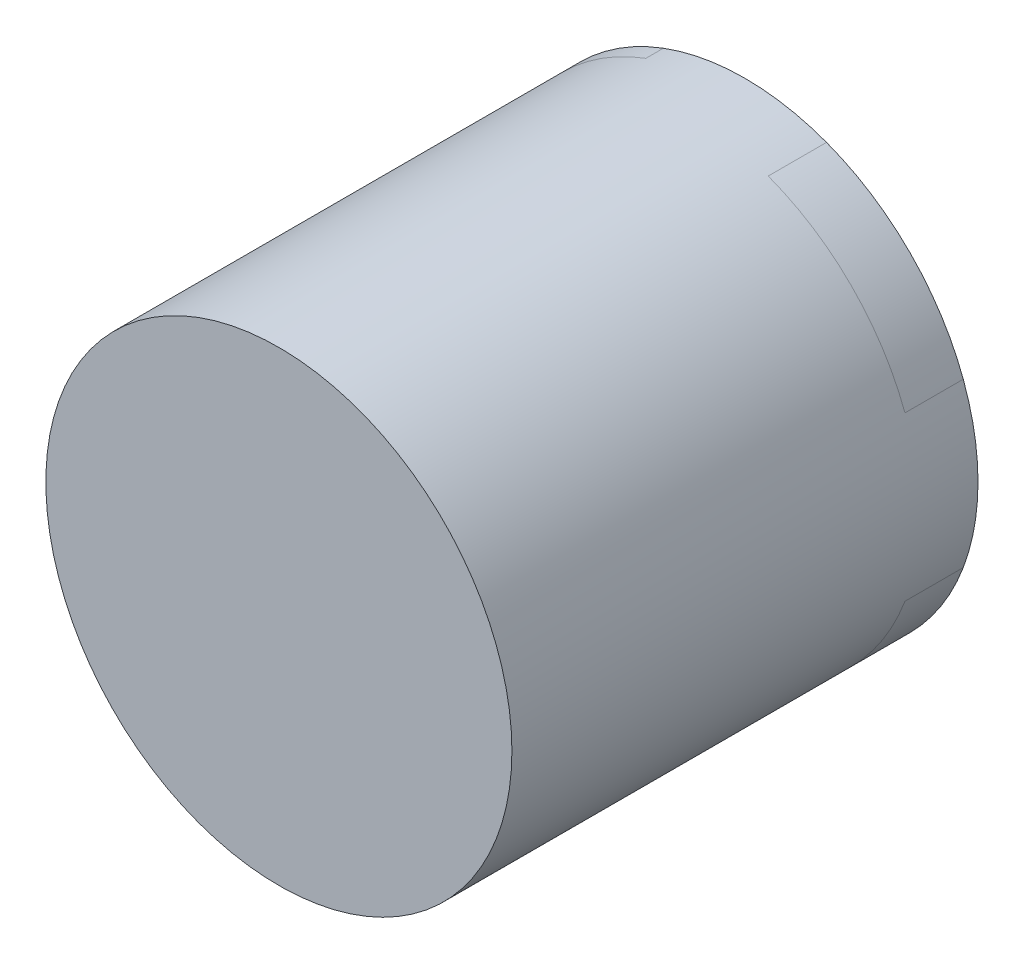
ISO-10303-21;
HEADER;
FILE_DESCRIPTION(('STEP AP214'),'2;1');
FILE_NAME('part.step','',(''),(''),'','','');
FILE_SCHEMA(('AUTOMOTIVE_DESIGN { 1 0 10303 214 1 1 1 1 }'));
ENDSEC;
DATA;
#1=APPLICATION_CONTEXT('core data for automotive mechanical design processes');
#2=APPLICATION_PROTOCOL_DEFINITION('international standard','automotive_design',2000,#1);
#3=PRODUCT_CONTEXT('',#1,'mechanical');
#4=PRODUCT('Part','Part','',(#3));
#5=PRODUCT_RELATED_PRODUCT_CATEGORY('part','',(#4));
#6=PRODUCT_DEFINITION_FORMATION('','',#4);
#7=PRODUCT_DEFINITION_CONTEXT('part definition',#1,'design');
#8=PRODUCT_DEFINITION('design','',#6,#7);
#9=PRODUCT_DEFINITION_SHAPE('','',#8);
#10=(LENGTH_UNIT() NAMED_UNIT(*) SI_UNIT(.MILLI.,.METRE.));
#11=(NAMED_UNIT(*) PLANE_ANGLE_UNIT() SI_UNIT($,.RADIAN.));
#12=(NAMED_UNIT(*) SI_UNIT($,.STERADIAN.) SOLID_ANGLE_UNIT());
#13=UNCERTAINTY_MEASURE_WITH_UNIT(LENGTH_MEASURE(1.E-05),#10,'distance_accuracy_value','');
#14=(GEOMETRIC_REPRESENTATION_CONTEXT(3) GLOBAL_UNCERTAINTY_ASSIGNED_CONTEXT((#13)) GLOBAL_UNIT_ASSIGNED_CONTEXT((#10,
#11,#12)) REPRESENTATION_CONTEXT('',''));
#15=CARTESIAN_POINT('',(0.,0.,0.));
#16=DIRECTION('',(0.,0.,1.));
#17=DIRECTION('',(1.,0.,0.));
#18=AXIS2_PLACEMENT_3D('',#15,#16,#17);
#19=CARTESIAN_POINT('',(0.,0.,10.499));
#20=DIRECTION('',(0.,0.,1.));
#21=DIRECTION('',(1.,0.,0.));
#22=AXIS2_PLACEMENT_3D('',#19,#20,#21);
#23=PLANE('',#22);
#24=CARTESIAN_POINT('',(0.,0.,10.499));
#25=DIRECTION('',(0.,0.,1.));
#26=DIRECTION('',(1.,0.,0.));
#27=AXIS2_PLACEMENT_3D('',#24,#25,#26);
#28=CIRCLE('',#27,5.);
#29=CARTESIAN_POINT('',(5.,0.,10.499));
#30=VERTEX_POINT('',#29);
#31=EDGE_CURVE('E11',#30,#30,#28,.T.);
#32=ORIENTED_EDGE('',*,*,#31,.T.);
#33=EDGE_LOOP('',(#32));
#34=FACE_BOUND('',#33,.T.);
#35=ADVANCED_FACE('F17',(#34),#23,.T.);
#36=CARTESIAN_POINT('',(0.,0.,0.499));
#37=DIRECTION('',(0.,0.,1.));
#38=DIRECTION('',(1.,0.,0.));
#39=AXIS2_PLACEMENT_3D('',#36,#37,#38);
#40=CYLINDRICAL_SURFACE('',#39,5.);
#41=CARTESIAN_POINT('',(0.,0.,0.499));
#42=DIRECTION('',(0.,0.,1.));
#43=DIRECTION('',(1.,0.,0.));
#44=AXIS2_PLACEMENT_3D('',#41,#42,#43);
#45=CIRCLE('',#44,5.);
#46=CARTESIAN_POINT('',(-4.683748498799,-1.75,0.499));
#47=VERTEX_POINT('',#46);
#48=CARTESIAN_POINT('',(-1.75,-4.683748498799,0.499));
#49=VERTEX_POINT('',#48);
#50=EDGE_CURVE('E209',#47,#49,#45,.T.);
#51=ORIENTED_EDGE('',*,*,#50,.T.);
#52=DIRECTION('',(0.,0.,1.));
#53=VECTOR('',#52,1.);
#54=CARTESIAN_POINT('',(-1.75,-4.683748498799,0.349966666667));
#55=LINE('',#54,#53);
#56=CARTESIAN_POINT('',(-1.75,-4.683748498799,0.874916666667));
#57=VERTEX_POINT('',#56);
#58=EDGE_CURVE('E171',#49,#57,#55,.T.);
#59=ORIENTED_EDGE('',*,*,#58,.T.);
#60=CARTESIAN_POINT('',(0.,0.,0.874916666667));
#61=DIRECTION('',(0.,0.,1.));
#62=DIRECTION('',(1.,0.,0.));
#63=AXIS2_PLACEMENT_3D('',#60,#61,#62);
#64=CIRCLE('',#63,5.);
#65=CARTESIAN_POINT('',(-4.683748498799,-1.75,0.874916666667));
#66=VERTEX_POINT('',#65);
#67=EDGE_CURVE('E175',#66,#57,#64,.T.);
#68=ORIENTED_EDGE('',*,*,#67,.F.);
#69=DIRECTION('',(0.,0.,1.));
#70=VECTOR('',#69,1.);
#71=CARTESIAN_POINT('',(-4.683748498799,-1.75,0.349966666667));
#72=LINE('',#71,#70);
#73=EDGE_CURVE('E261',#47,#66,#72,.T.);
#74=ORIENTED_EDGE('',*,*,#73,.F.);
#75=EDGE_LOOP('',(#51,#59,#68,#74));
#76=FACE_BOUND('',#75,.T.);
#77=ADVANCED_FACE('F346',(#76),#40,.T.);
#78=CARTESIAN_POINT('',(0.,0.,0.499));
#79=DIRECTION('',(0.,0.,1.));
#80=DIRECTION('',(1.,0.,0.));
#81=AXIS2_PLACEMENT_3D('',#78,#79,#80);
#82=CYLINDRICAL_SURFACE('',#81,5.);
#83=DIRECTION('',(0.,0.,1.));
#84=VECTOR('',#83,1.);
#85=CARTESIAN_POINT('',(-1.75,4.683748498799,0.349966666667));
#86=LINE('',#85,#84);
#87=CARTESIAN_POINT('',(-1.75,4.683748498799,0.499));
#88=VERTEX_POINT('',#87);
#89=CARTESIAN_POINT('',(-1.75,4.683748498799,0.874916666667));
#90=VERTEX_POINT('',#89);
#91=EDGE_CURVE('E192',#88,#90,#86,.T.);
#92=ORIENTED_EDGE('',*,*,#91,.F.);
#93=CARTESIAN_POINT('',(0.,0.,0.499));
#94=DIRECTION('',(0.,0.,1.));
#95=DIRECTION('',(1.,0.,0.));
#96=AXIS2_PLACEMENT_3D('',#93,#94,#95);
#97=CIRCLE('',#96,5.);
#98=CARTESIAN_POINT('',(-4.683748498799,1.75,0.499));
#99=VERTEX_POINT('',#98);
#100=EDGE_CURVE('E201',#88,#99,#97,.T.);
#101=ORIENTED_EDGE('',*,*,#100,.T.);
#102=DIRECTION('',(0.,0.,1.));
#103=VECTOR('',#102,1.);
#104=CARTESIAN_POINT('',(-4.683748498799,1.75,0.349966666667));
#105=LINE('',#104,#103);
#106=CARTESIAN_POINT('',(-4.683748498799,1.75,0.874916666667));
#107=VERTEX_POINT('',#106);
#108=EDGE_CURVE('E191',#99,#107,#105,.T.);
#109=ORIENTED_EDGE('',*,*,#108,.T.);
#110=CARTESIAN_POINT('',(0.,0.,0.874916666667));
#111=DIRECTION('',(0.,0.,1.));
#112=DIRECTION('',(1.,0.,0.));
#113=AXIS2_PLACEMENT_3D('',#110,#111,#112);
#114=CIRCLE('',#113,5.);
#115=EDGE_CURVE('E187',#90,#107,#114,.T.);
#116=ORIENTED_EDGE('',*,*,#115,.F.);
#117=EDGE_LOOP('',(#92,#101,#109,#116));
#118=FACE_BOUND('',#117,.T.);
#119=ADVANCED_FACE('F342',(#118),#82,.T.);
#120=CARTESIAN_POINT('',(0.,0.,0.499));
#121=DIRECTION('',(0.,0.,1.));
#122=DIRECTION('',(1.,0.,0.));
#123=AXIS2_PLACEMENT_3D('',#120,#121,#122);
#124=CYLINDRICAL_SURFACE('',#123,5.);
#125=CARTESIAN_POINT('',(0.,0.,0.499));
#126=DIRECTION('',(0.,0.,1.));
#127=DIRECTION('',(1.,0.,0.));
#128=AXIS2_PLACEMENT_3D('',#125,#126,#127);
#129=CIRCLE('',#128,5.);
#130=CARTESIAN_POINT('',(1.75,-4.683748498799,0.499));
#131=VERTEX_POINT('',#130);
#132=CARTESIAN_POINT('',(4.683748498799,-1.75,0.499));
#133=VERTEX_POINT('',#132);
#134=EDGE_CURVE('E253',#131,#133,#129,.T.);
#135=ORIENTED_EDGE('',*,*,#134,.T.);
#136=DIRECTION('',(0.,0.,1.));
#137=VECTOR('',#136,1.);
#138=CARTESIAN_POINT('',(4.683748498799,-1.75,0.349966666667));
#139=LINE('',#138,#137);
#140=CARTESIAN_POINT('',(4.683748498799,-1.75,1.749833333333));
#141=VERTEX_POINT('',#140);
#142=EDGE_CURVE('E27',#133,#141,#139,.T.);
#143=ORIENTED_EDGE('',*,*,#142,.T.);
#144=CARTESIAN_POINT('',(0.,0.,1.749833333333));
#145=DIRECTION('',(0.,0.,1.));
#146=DIRECTION('',(1.,0.,0.));
#147=AXIS2_PLACEMENT_3D('',#144,#145,#146);
#148=CIRCLE('',#147,5.);
#149=CARTESIAN_POINT('',(1.75,-4.683748498799,1.749833333333));
#150=VERTEX_POINT('',#149);
#151=EDGE_CURVE('E194',#150,#141,#148,.T.);
#152=ORIENTED_EDGE('',*,*,#151,.F.);
#153=DIRECTION('',(0.,0.,1.));
#154=VECTOR('',#153,1.);
#155=CARTESIAN_POINT('',(1.75,-4.683748498799,0.349966666667));
#156=LINE('',#155,#154);
#157=EDGE_CURVE('E174',#131,#150,#156,.T.);
#158=ORIENTED_EDGE('',*,*,#157,.F.);
#159=EDGE_LOOP('',(#135,#143,#152,#158));
#160=FACE_BOUND('',#159,.T.);
#161=ADVANCED_FACE('F333',(#160),#124,.T.);
#162=CARTESIAN_POINT('',(0.,0.,0.499));
#163=DIRECTION('',(0.,0.,1.));
#164=DIRECTION('',(1.,0.,0.));
#165=AXIS2_PLACEMENT_3D('',#162,#163,#164);
#166=CYLINDRICAL_SURFACE('',#165,5.);
#167=DIRECTION('',(0.,0.,1.));
#168=VECTOR('',#167,1.);
#169=CARTESIAN_POINT('',(4.683748498799,1.75,0.349966666667));
#170=LINE('',#169,#168);
#171=CARTESIAN_POINT('',(4.683748498799,1.75,0.499));
#172=VERTEX_POINT('',#171);
#173=CARTESIAN_POINT('',(4.683748498799,1.75,1.749833333333));
#174=VERTEX_POINT('',#173);
#175=EDGE_CURVE('E218',#172,#174,#170,.T.);
#176=ORIENTED_EDGE('',*,*,#175,.F.);
#177=CARTESIAN_POINT('',(0.,0.,0.499));
#178=DIRECTION('',(0.,0.,1.));
#179=DIRECTION('',(1.,0.,0.));
#180=AXIS2_PLACEMENT_3D('',#177,#178,#179);
#181=CIRCLE('',#180,5.);
#182=CARTESIAN_POINT('',(1.75,4.683748498799,0.499));
#183=VERTEX_POINT('',#182);
#184=EDGE_CURVE('E181',#172,#183,#181,.T.);
#185=ORIENTED_EDGE('',*,*,#184,.T.);
#186=DIRECTION('',(0.,0.,1.));
#187=VECTOR('',#186,1.);
#188=CARTESIAN_POINT('',(1.75,4.683748498799,0.349966666667));
#189=LINE('',#188,#187);
#190=CARTESIAN_POINT('',(1.75,4.683748498799,1.749833333333));
#191=VERTEX_POINT('',#190);
#192=EDGE_CURVE('E238',#183,#191,#189,.T.);
#193=ORIENTED_EDGE('',*,*,#192,.T.);
#194=CARTESIAN_POINT('',(0.,0.,1.749833333333));
#195=DIRECTION('',(0.,0.,1.));
#196=DIRECTION('',(1.,0.,0.));
#197=AXIS2_PLACEMENT_3D('',#194,#195,#196);
#198=CIRCLE('',#197,5.);
#199=EDGE_CURVE('E20',#174,#191,#198,.T.);
#200=ORIENTED_EDGE('',*,*,#199,.F.);
#201=EDGE_LOOP('',(#176,#185,#193,#200));
#202=FACE_BOUND('',#201,.T.);
#203=ADVANCED_FACE('F331',(#202),#166,.T.);
#204=CARTESIAN_POINT('',(0.,0.,0.499));
#205=DIRECTION('',(0.,0.,1.));
#206=DIRECTION('',(1.,0.,0.));
#207=AXIS2_PLACEMENT_3D('',#204,#205,#206);
#208=CYLINDRICAL_SURFACE('',#207,5.);
#209=DIRECTION('',(0.,0.,1.));
#210=VECTOR('',#209,1.);
#211=CARTESIAN_POINT('',(5.,0.,0.499));
#212=LINE('',#211,#210);
#213=CARTESIAN_POINT('',(5.,0.,0.499));
#214=VERTEX_POINT('',#213);
#215=EDGE_CURVE('E185',#214,#30,#212,.T.);
#216=ORIENTED_EDGE('',*,*,#215,.F.);
#217=CARTESIAN_POINT('',(0.,0.,0.499));
#218=DIRECTION('',(0.,0.,1.));
#219=DIRECTION('',(1.,0.,0.));
#220=AXIS2_PLACEMENT_3D('',#217,#218,#219);
#221=CIRCLE('',#220,5.);
#222=EDGE_CURVE('E301',#214,#172,#221,.T.);
#223=ORIENTED_EDGE('',*,*,#222,.T.);
#224=ORIENTED_EDGE('',*,*,#175,.T.);
#225=ORIENTED_EDGE('',*,*,#199,.T.);
#226=ORIENTED_EDGE('',*,*,#192,.F.);
#227=CARTESIAN_POINT('',(0.,0.,0.499));
#228=DIRECTION('',(0.,0.,1.));
#229=DIRECTION('',(1.,0.,0.));
#230=AXIS2_PLACEMENT_3D('',#227,#228,#229);
#231=CIRCLE('',#230,5.);
#232=EDGE_CURVE('E186',#183,#88,#231,.T.);
#233=ORIENTED_EDGE('',*,*,#232,.T.);
#234=ORIENTED_EDGE('',*,*,#91,.T.);
#235=ORIENTED_EDGE('',*,*,#115,.T.);
#236=ORIENTED_EDGE('',*,*,#108,.F.);
#237=CARTESIAN_POINT('',(0.,0.,0.499));
#238=DIRECTION('',(0.,0.,1.));
#239=DIRECTION('',(1.,0.,0.));
#240=AXIS2_PLACEMENT_3D('',#237,#238,#239);
#241=CIRCLE('',#240,5.);
#242=EDGE_CURVE('E204',#99,#47,#241,.T.);
#243=ORIENTED_EDGE('',*,*,#242,.T.);
#244=ORIENTED_EDGE('',*,*,#73,.T.);
#245=ORIENTED_EDGE('',*,*,#67,.T.);
#246=ORIENTED_EDGE('',*,*,#58,.F.);
#247=CARTESIAN_POINT('',(0.,0.,0.499));
#248=DIRECTION('',(0.,0.,1.));
#249=DIRECTION('',(1.,0.,0.));
#250=AXIS2_PLACEMENT_3D('',#247,#248,#249);
#251=CIRCLE('',#250,5.);
#252=EDGE_CURVE('E265',#49,#131,#251,.T.);
#253=ORIENTED_EDGE('',*,*,#252,.T.);
#254=ORIENTED_EDGE('',*,*,#157,.T.);
#255=ORIENTED_EDGE('',*,*,#151,.T.);
#256=ORIENTED_EDGE('',*,*,#142,.F.);
#257=CARTESIAN_POINT('',(0.,0.,0.499));
#258=DIRECTION('',(0.,0.,1.));
#259=DIRECTION('',(1.,0.,0.));
#260=AXIS2_PLACEMENT_3D('',#257,#258,#259);
#261=CIRCLE('',#260,5.);
#262=EDGE_CURVE('E278',#133,#214,#261,.T.);
#263=ORIENTED_EDGE('',*,*,#262,.T.);
#264=ORIENTED_EDGE('',*,*,#215,.T.);
#265=ORIENTED_EDGE('',*,*,#31,.F.);
#266=EDGE_LOOP('',(#216,#223,#224,#225,#226,#233,#234,#235,#236,#243,#244,#245,#246,#253,#254,
#255,#256,#263,#264,#265));
#267=FACE_BOUND('',#266,.T.);
#268=ADVANCED_FACE('F324',(#267),#208,.T.);
#269=CARTESIAN_POINT('',(-5.25,-1.75,0.349966666667));
#270=DIRECTION('',(0.,0.,1.));
#271=DIRECTION('',(1.,0.,0.));
#272=AXIS2_PLACEMENT_3D('',#269,#270,#271);
#273=PLANE('',#272);
#274=DIRECTION('',(0.,1.,0.));
#275=VECTOR('',#274,1.);
#276=CARTESIAN_POINT('',(1.75,-5.25,0.349966666667));
#277=LINE('',#276,#275);
#278=CARTESIAN_POINT('',(1.75,-1.75,0.349966666667));
#279=VERTEX_POINT('',#278);
#280=CARTESIAN_POINT('',(1.75,1.75,0.349966666667));
#281=VERTEX_POINT('',#280);
#282=EDGE_CURVE('E219',#279,#281,#277,.T.);
#283=ORIENTED_EDGE('',*,*,#282,.F.);
#284=DIRECTION('',(1.,0.,0.));
#285=VECTOR('',#284,1.);
#286=CARTESIAN_POINT('',(-5.25,-1.75,0.349966666667));
#287=LINE('',#286,#285);
#288=CARTESIAN_POINT('',(-1.75,-1.75,0.349966666667));
#289=VERTEX_POINT('',#288);
#290=EDGE_CURVE('E143',#289,#279,#287,.T.);
#291=ORIENTED_EDGE('',*,*,#290,.F.);
#292=DIRECTION('',(0.,1.,0.));
#293=VECTOR('',#292,1.);
#294=CARTESIAN_POINT('',(-1.75,-5.25,0.349966666667));
#295=LINE('',#294,#293);
#296=CARTESIAN_POINT('',(-1.75,1.75,0.349966666667));
#297=VERTEX_POINT('',#296);
#298=EDGE_CURVE('E214',#289,#297,#295,.T.);
#299=ORIENTED_EDGE('',*,*,#298,.T.);
#300=DIRECTION('',(1.,0.,0.));
#301=VECTOR('',#300,1.);
#302=CARTESIAN_POINT('',(-5.25,1.75,0.349966666667));
#303=LINE('',#302,#301);
#304=EDGE_CURVE('E179',#297,#281,#303,.T.);
#305=ORIENTED_EDGE('',*,*,#304,.T.);
#306=EDGE_LOOP('',(#283,#291,#299,#305));
#307=FACE_BOUND('',#306,.T.);
#308=ADVANCED_FACE('F340',(#307),#273,.F.);
#309=CARTESIAN_POINT('',(0.,0.,0.499));
#310=DIRECTION('',(0.,0.,1.));
#311=DIRECTION('',(1.,0.,0.));
#312=AXIS2_PLACEMENT_3D('',#309,#310,#311);
#313=PLANE('',#312);
#314=CARTESIAN_POINT('',(0.,0.,0.499));
#315=DIRECTION('',(0.,0.,1.));
#316=DIRECTION('',(1.,0.,0.));
#317=AXIS2_PLACEMENT_3D('',#314,#315,#316);
#318=CIRCLE('',#317,4.375);
#319=CARTESIAN_POINT('',(4.375,0.,0.499));
#320=VERTEX_POINT('',#319);
#321=EDGE_CURVE('E225',#320,#320,#318,.T.);
#322=ORIENTED_EDGE('',*,*,#321,.T.);
#323=EDGE_LOOP('',(#322));
#324=FACE_BOUND('',#323,.T.);
#325=ORIENTED_EDGE('',*,*,#222,.F.);
#326=ORIENTED_EDGE('',*,*,#262,.F.);
#327=ORIENTED_EDGE('',*,*,#134,.F.);
#328=ORIENTED_EDGE('',*,*,#252,.F.);
#329=ORIENTED_EDGE('',*,*,#50,.F.);
#330=ORIENTED_EDGE('',*,*,#242,.F.);
#331=ORIENTED_EDGE('',*,*,#100,.F.);
#332=ORIENTED_EDGE('',*,*,#232,.F.);
#333=ORIENTED_EDGE('',*,*,#184,.F.);
#334=EDGE_LOOP('',(#325,#326,#327,#328,#329,#330,#331,#332,#333));
#335=FACE_BOUND('',#334,.T.);
#336=ADVANCED_FACE('F328',(#324,#335),#313,.F.);
#337=CARTESIAN_POINT('',(0.,0.,0.349966666667));
#338=DIRECTION('',(0.,0.,1.));
#339=DIRECTION('',(1.,0.,0.));
#340=AXIS2_PLACEMENT_3D('',#337,#338,#339);
#341=PLANE('',#340);
#342=CARTESIAN_POINT('',(0.,0.,0.349966666667));
#343=DIRECTION('',(0.,0.,1.));
#344=DIRECTION('',(1.,0.,0.));
#345=AXIS2_PLACEMENT_3D('',#342,#343,#344);
#346=CIRCLE('',#345,4.375);
#347=CARTESIAN_POINT('',(4.009753733086,1.75,0.349966666667));
#348=VERTEX_POINT('',#347);
#349=CARTESIAN_POINT('',(1.75,4.009753733086,0.349966666667));
#350=VERTEX_POINT('',#349);
#351=EDGE_CURVE('E200',#348,#350,#346,.T.);
#352=ORIENTED_EDGE('',*,*,#351,.F.);
#353=DIRECTION('',(1.,0.,0.));
#354=VECTOR('',#353,1.);
#355=CARTESIAN_POINT('',(-5.25,1.75,0.349966666667));
#356=LINE('',#355,#354);
#357=EDGE_CURVE('E223',#281,#348,#356,.T.);
#358=ORIENTED_EDGE('',*,*,#357,.F.);
#359=DIRECTION('',(0.,1.,0.));
#360=VECTOR('',#359,1.);
#361=CARTESIAN_POINT('',(1.75,-5.25,0.349966666667));
#362=LINE('',#361,#360);
#363=EDGE_CURVE('E176',#281,#350,#362,.T.);
#364=ORIENTED_EDGE('',*,*,#363,.T.);
#365=EDGE_LOOP('',(#352,#358,#364));
#366=FACE_BOUND('',#365,.T.);
#367=ADVANCED_FACE('F359',(#366),#341,.F.);
#368=CARTESIAN_POINT('',(-1.75,-5.25,0.349966666667));
#369=DIRECTION('',(0.,0.,1.));
#370=DIRECTION('',(1.,0.,0.));
#371=AXIS2_PLACEMENT_3D('',#368,#369,#370);
#372=PLANE('',#371);
#373=CARTESIAN_POINT('',(0.,0.,0.349966666667));
#374=DIRECTION('',(0.,0.,1.));
#375=DIRECTION('',(1.,0.,0.));
#376=AXIS2_PLACEMENT_3D('',#373,#374,#375);
#377=CIRCLE('',#376,4.375);
#378=CARTESIAN_POINT('',(-1.75,4.009753733086,0.349966666667));
#379=VERTEX_POINT('',#378);
#380=EDGE_CURVE('E196',#350,#379,#377,.T.);
#381=ORIENTED_EDGE('',*,*,#380,.F.);
#382=ORIENTED_EDGE('',*,*,#363,.F.);
#383=ORIENTED_EDGE('',*,*,#304,.F.);
#384=DIRECTION('',(0.,1.,0.));
#385=VECTOR('',#384,1.);
#386=CARTESIAN_POINT('',(-1.75,-5.25,0.349966666667));
#387=LINE('',#386,#385);
#388=EDGE_CURVE('E180',#297,#379,#387,.T.);
#389=ORIENTED_EDGE('',*,*,#388,.T.);
#390=EDGE_LOOP('',(#381,#382,#383,#389));
#391=FACE_BOUND('',#390,.T.);
#392=ADVANCED_FACE('F365',(#391),#372,.F.);
#393=CARTESIAN_POINT('',(0.,0.,0.349966666667));
#394=DIRECTION('',(0.,0.,1.));
#395=DIRECTION('',(1.,0.,0.));
#396=AXIS2_PLACEMENT_3D('',#393,#394,#395);
#397=PLANE('',#396);
#398=CARTESIAN_POINT('',(0.,0.,0.349966666667));
#399=DIRECTION('',(0.,0.,1.));
#400=DIRECTION('',(1.,0.,0.));
#401=AXIS2_PLACEMENT_3D('',#398,#399,#400);
#402=CIRCLE('',#401,4.375);
#403=CARTESIAN_POINT('',(-4.009753733086,1.75,0.349966666667));
#404=VERTEX_POINT('',#403);
#405=EDGE_CURVE('E166',#379,#404,#402,.T.);
#406=ORIENTED_EDGE('',*,*,#405,.F.);
#407=ORIENTED_EDGE('',*,*,#388,.F.);
#408=DIRECTION('',(1.,0.,0.));
#409=VECTOR('',#408,1.);
#410=CARTESIAN_POINT('',(-5.25,1.75,0.349966666667));
#411=LINE('',#410,#409);
#412=EDGE_CURVE('E210',#404,#297,#411,.T.);
#413=ORIENTED_EDGE('',*,*,#412,.F.);
#414=EDGE_LOOP('',(#406,#407,#413));
#415=FACE_BOUND('',#414,.T.);
#416=ADVANCED_FACE('F422',(#415),#397,.F.);
#417=CARTESIAN_POINT('',(-5.25,-1.75,0.349966666667));
#418=DIRECTION('',(0.,0.,1.));
#419=DIRECTION('',(1.,0.,0.));
#420=AXIS2_PLACEMENT_3D('',#417,#418,#419);
#421=PLANE('',#420);
#422=ORIENTED_EDGE('',*,*,#298,.F.);
#423=DIRECTION('',(1.,0.,0.));
#424=VECTOR('',#423,1.);
#425=CARTESIAN_POINT('',(-5.25,-1.75,0.349966666667));
#426=LINE('',#425,#424);
#427=CARTESIAN_POINT('',(-4.009753733086,-1.75,0.349966666667));
#428=VERTEX_POINT('',#427);
#429=EDGE_CURVE('E138',#428,#289,#426,.T.);
#430=ORIENTED_EDGE('',*,*,#429,.F.);
#431=CARTESIAN_POINT('',(0.,0.,0.349966666667));
#432=DIRECTION('',(0.,0.,1.));
#433=DIRECTION('',(1.,0.,0.));
#434=AXIS2_PLACEMENT_3D('',#431,#432,#433);
#435=CIRCLE('',#434,4.375);
#436=EDGE_CURVE('E160',#404,#428,#435,.T.);
#437=ORIENTED_EDGE('',*,*,#436,.F.);
#438=ORIENTED_EDGE('',*,*,#412,.T.);
#439=EDGE_LOOP('',(#422,#430,#437,#438));
#440=FACE_BOUND('',#439,.T.);
#441=ADVANCED_FACE('F405',(#440),#421,.F.);
#442=CARTESIAN_POINT('',(0.,0.,0.349966666667));
#443=DIRECTION('',(0.,0.,1.));
#444=DIRECTION('',(1.,0.,0.));
#445=AXIS2_PLACEMENT_3D('',#442,#443,#444);
#446=PLANE('',#445);
#447=DIRECTION('',(0.,1.,0.));
#448=VECTOR('',#447,1.);
#449=CARTESIAN_POINT('',(-1.75,-5.25,0.349966666667));
#450=LINE('',#449,#448);
#451=CARTESIAN_POINT('',(-1.75,-4.009753733086,0.349966666667));
#452=VERTEX_POINT('',#451);
#453=EDGE_CURVE('E132',#452,#289,#450,.T.);
#454=ORIENTED_EDGE('',*,*,#453,.F.);
#455=CARTESIAN_POINT('',(0.,0.,0.349966666667));
#456=DIRECTION('',(0.,0.,1.));
#457=DIRECTION('',(1.,0.,0.));
#458=AXIS2_PLACEMENT_3D('',#455,#456,#457);
#459=CIRCLE('',#458,4.375);
#460=EDGE_CURVE('E136',#428,#452,#459,.T.);
#461=ORIENTED_EDGE('',*,*,#460,.F.);
#462=ORIENTED_EDGE('',*,*,#429,.T.);
#463=EDGE_LOOP('',(#454,#461,#462));
#464=FACE_BOUND('',#463,.T.);
#465=ADVANCED_FACE('F134',(#464),#446,.F.);
#466=CARTESIAN_POINT('',(-1.75,-5.25,0.349966666667));
#467=DIRECTION('',(0.,0.,1.));
#468=DIRECTION('',(1.,0.,0.));
#469=AXIS2_PLACEMENT_3D('',#466,#467,#468);
#470=PLANE('',#469);
#471=ORIENTED_EDGE('',*,*,#290,.T.);
#472=DIRECTION('',(0.,1.,0.));
#473=VECTOR('',#472,1.);
#474=CARTESIAN_POINT('',(1.75,-5.25,0.349966666667));
#475=LINE('',#474,#473);
#476=CARTESIAN_POINT('',(1.75,-4.009753733086,0.349966666667));
#477=VERTEX_POINT('',#476);
#478=EDGE_CURVE('E149',#477,#279,#475,.T.);
#479=ORIENTED_EDGE('',*,*,#478,.F.);
#480=CARTESIAN_POINT('',(0.,0.,0.349966666667));
#481=DIRECTION('',(0.,0.,1.));
#482=DIRECTION('',(1.,0.,0.));
#483=AXIS2_PLACEMENT_3D('',#480,#481,#482);
#484=CIRCLE('',#483,4.375);
#485=EDGE_CURVE('E146',#452,#477,#484,.T.);
#486=ORIENTED_EDGE('',*,*,#485,.F.);
#487=ORIENTED_EDGE('',*,*,#453,.T.);
#488=EDGE_LOOP('',(#471,#479,#486,#487));
#489=FACE_BOUND('',#488,.T.);
#490=ADVANCED_FACE('F147',(#489),#470,.F.);
#491=CARTESIAN_POINT('',(0.,0.,0.349966666667));
#492=DIRECTION('',(0.,0.,1.));
#493=DIRECTION('',(1.,0.,0.));
#494=AXIS2_PLACEMENT_3D('',#491,#492,#493);
#495=PLANE('',#494);
#496=DIRECTION('',(1.,0.,0.));
#497=VECTOR('',#496,1.);
#498=CARTESIAN_POINT('',(-5.25,-1.75,0.349966666667));
#499=LINE('',#498,#497);
#500=CARTESIAN_POINT('',(4.009753733086,-1.75,0.349966666667));
#501=VERTEX_POINT('',#500);
#502=EDGE_CURVE('E224',#279,#501,#499,.T.);
#503=ORIENTED_EDGE('',*,*,#502,.T.);
#504=CARTESIAN_POINT('',(0.,0.,0.349966666667));
#505=DIRECTION('',(0.,0.,1.));
#506=DIRECTION('',(1.,0.,0.));
#507=AXIS2_PLACEMENT_3D('',#504,#505,#506);
#508=CIRCLE('',#507,4.375);
#509=EDGE_CURVE('E154',#477,#501,#508,.T.);
#510=ORIENTED_EDGE('',*,*,#509,.F.);
#511=ORIENTED_EDGE('',*,*,#478,.T.);
#512=EDGE_LOOP('',(#503,#510,#511));
#513=FACE_BOUND('',#512,.T.);
#514=ADVANCED_FACE('F408',(#513),#495,.F.);
#515=CARTESIAN_POINT('',(-5.25,-1.75,0.349966666667));
#516=DIRECTION('',(0.,0.,1.));
#517=DIRECTION('',(1.,0.,0.));
#518=AXIS2_PLACEMENT_3D('',#515,#516,#517);
#519=PLANE('',#518);
#520=CARTESIAN_POINT('',(0.,0.,0.349966666667));
#521=DIRECTION('',(0.,0.,1.));
#522=DIRECTION('',(1.,0.,0.));
#523=AXIS2_PLACEMENT_3D('',#520,#521,#522);
#524=CIRCLE('',#523,4.375);
#525=CARTESIAN_POINT('',(4.375,0.,0.349966666667));
#526=VERTEX_POINT('',#525);
#527=EDGE_CURVE('E228',#526,#348,#524,.T.);
#528=ORIENTED_EDGE('',*,*,#527,.F.);
#529=CARTESIAN_POINT('',(0.,0.,0.349966666667));
#530=DIRECTION('',(0.,0.,1.));
#531=DIRECTION('',(1.,0.,0.));
#532=AXIS2_PLACEMENT_3D('',#529,#530,#531);
#533=CIRCLE('',#532,4.375);
#534=EDGE_CURVE('E315',#501,#526,#533,.T.);
#535=ORIENTED_EDGE('',*,*,#534,.F.);
#536=ORIENTED_EDGE('',*,*,#502,.F.);
#537=ORIENTED_EDGE('',*,*,#282,.T.);
#538=ORIENTED_EDGE('',*,*,#357,.T.);
#539=EDGE_LOOP('',(#528,#535,#536,#537,#538));
#540=FACE_BOUND('',#539,.T.);
#541=ADVANCED_FACE('F384',(#540),#519,.F.);
#542=CARTESIAN_POINT('',(0.,0.,0.2495));
#543=DIRECTION('',(0.,0.,1.));
#544=DIRECTION('',(1.,0.,0.));
#545=AXIS2_PLACEMENT_3D('',#542,#543,#544);
#546=CYLINDRICAL_SURFACE('',#545,4.375);
#547=ORIENTED_EDGE('',*,*,#534,.T.);
#548=DIRECTION('',(0.,0.,1.));
#549=VECTOR('',#548,1.);
#550=CARTESIAN_POINT('',(4.375,0.,0.2495));
#551=LINE('',#550,#549);
#552=EDGE_CURVE('E229',#526,#320,#551,.T.);
#553=ORIENTED_EDGE('',*,*,#552,.T.);
#554=ORIENTED_EDGE('',*,*,#321,.F.);
#555=ORIENTED_EDGE('',*,*,#552,.F.);
#556=ORIENTED_EDGE('',*,*,#527,.T.);
#557=ORIENTED_EDGE('',*,*,#351,.T.);
#558=ORIENTED_EDGE('',*,*,#380,.T.);
#559=ORIENTED_EDGE('',*,*,#405,.T.);
#560=ORIENTED_EDGE('',*,*,#436,.T.);
#561=ORIENTED_EDGE('',*,*,#460,.T.);
#562=ORIENTED_EDGE('',*,*,#485,.T.);
#563=ORIENTED_EDGE('',*,*,#509,.T.);
#564=EDGE_LOOP('',(#547,#553,#554,#555,#556,#557,#558,#559,#560,#561,#562,#563));
#565=FACE_BOUND('',#564,.T.);
#566=ADVANCED_FACE('F157',(#565),#546,.T.);
#567=CLOSED_SHELL('',(#35,#77,#119,#161,#203,#268,#308,#336,#367,#392,#416,#441,#465,#490,#514,
#541,#566));
#568=MANIFOLD_SOLID_BREP('B1',#567);
#569=ADVANCED_BREP_SHAPE_REPRESENTATION('',(#18,#568),#14);
#570=SHAPE_DEFINITION_REPRESENTATION(#9,#569);
ENDSEC;
END-ISO-10303-21;
